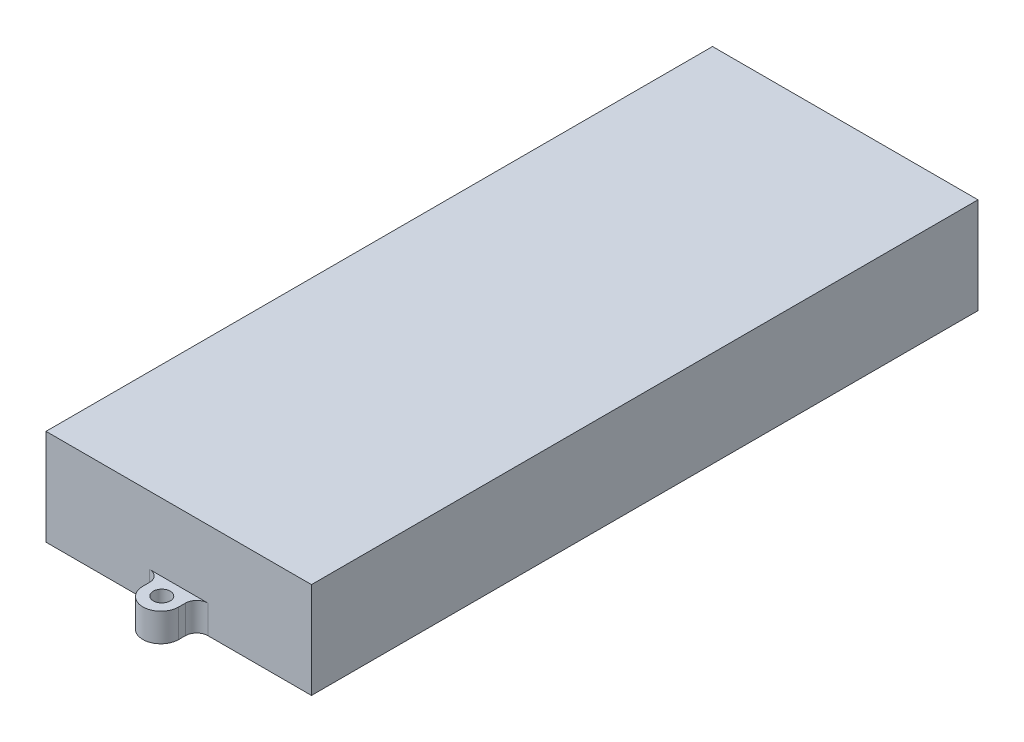
ISO-10303-21;
HEADER;
FILE_DESCRIPTION(('STEP AP214'),'2;1');
FILE_NAME('part.step','',(''),(''),'','','');
FILE_SCHEMA(('AUTOMOTIVE_DESIGN { 1 0 10303 214 1 1 1 1 }'));
ENDSEC;
DATA;
#1=APPLICATION_CONTEXT('core data for automotive mechanical design processes');
#2=APPLICATION_PROTOCOL_DEFINITION('international standard','automotive_design',2000,#1);
#3=PRODUCT_CONTEXT('',#1,'mechanical');
#4=PRODUCT('Part','Part','',(#3));
#5=PRODUCT_RELATED_PRODUCT_CATEGORY('part','',(#4));
#6=PRODUCT_DEFINITION_FORMATION('','',#4);
#7=PRODUCT_DEFINITION_CONTEXT('part definition',#1,'design');
#8=PRODUCT_DEFINITION('design','',#6,#7);
#9=PRODUCT_DEFINITION_SHAPE('','',#8);
#10=(LENGTH_UNIT() NAMED_UNIT(*) SI_UNIT(.MILLI.,.METRE.));
#11=(NAMED_UNIT(*) PLANE_ANGLE_UNIT() SI_UNIT($,.RADIAN.));
#12=(NAMED_UNIT(*) SI_UNIT($,.STERADIAN.) SOLID_ANGLE_UNIT());
#13=UNCERTAINTY_MEASURE_WITH_UNIT(LENGTH_MEASURE(1.E-05),#10,'distance_accuracy_value','');
#14=(GEOMETRIC_REPRESENTATION_CONTEXT(3) GLOBAL_UNCERTAINTY_ASSIGNED_CONTEXT((#13)) GLOBAL_UNIT_ASSIGNED_CONTEXT((#10,
#11,#12)) REPRESENTATION_CONTEXT('',''));
#15=CARTESIAN_POINT('',(0.,0.,0.));
#16=DIRECTION('',(0.,0.,1.));
#17=DIRECTION('',(1.,0.,0.));
#18=AXIS2_PLACEMENT_3D('',#15,#16,#17);
#19=CARTESIAN_POINT('',(-23.5,17.,59.));
#20=DIRECTION('',(0.,0.,-1.));
#21=DIRECTION('',(-1.,0.,0.));
#22=AXIS2_PLACEMENT_3D('',#19,#20,#21);
#23=PLANE('',#22);
#24=DIRECTION('',(1.,0.,0.));
#25=VECTOR('',#24,1.);
#26=CARTESIAN_POINT('',(-23.5,0.,59.));
#27=LINE('',#26,#25);
#28=CARTESIAN_POINT('',(-23.5,0.,59.));
#29=VERTEX_POINT('',#28);
#30=CARTESIAN_POINT('',(-5.175,0.,59.));
#31=VERTEX_POINT('',#30);
#32=EDGE_CURVE('E236',#29,#31,#27,.T.);
#33=ORIENTED_EDGE('',*,*,#32,.T.);
#34=DIRECTION('',(0.,-1.,0.));
#35=VECTOR('',#34,1.);
#36=CARTESIAN_POINT('',(-5.175,5.,59.));
#37=LINE('',#36,#35);
#38=CARTESIAN_POINT('',(-5.175,5.,59.));
#39=VERTEX_POINT('',#38);
#40=EDGE_CURVE('E297',#31,#39,#37,.F.);
#41=ORIENTED_EDGE('',*,*,#40,.T.);
#42=DIRECTION('',(-1.,0.,0.));
#43=VECTOR('',#42,1.);
#44=CARTESIAN_POINT('',(-3.175,5.,59.));
#45=LINE('',#44,#43);
#46=CARTESIAN_POINT('',(5.175,5.,59.));
#47=VERTEX_POINT('',#46);
#48=EDGE_CURVE('E194',#47,#39,#45,.T.);
#49=ORIENTED_EDGE('',*,*,#48,.F.);
#50=DIRECTION('',(0.,-1.,0.));
#51=VECTOR('',#50,1.);
#52=CARTESIAN_POINT('',(5.175,0.,59.));
#53=LINE('',#52,#51);
#54=CARTESIAN_POINT('',(5.175,0.,59.));
#55=VERTEX_POINT('',#54);
#56=EDGE_CURVE('E293',#47,#55,#53,.T.);
#57=ORIENTED_EDGE('',*,*,#56,.T.);
#58=CARTESIAN_POINT('',(23.5,0.,59.));
#59=VERTEX_POINT('',#58);
#60=EDGE_CURVE('E257',#55,#59,#27,.T.);
#61=ORIENTED_EDGE('',*,*,#60,.T.);
#62=DIRECTION('',(0.,-1.,0.));
#63=VECTOR('',#62,1.);
#64=CARTESIAN_POINT('',(23.5,17.,59.));
#65=LINE('',#64,#63);
#66=CARTESIAN_POINT('',(23.5,17.,59.));
#67=VERTEX_POINT('',#66);
#68=EDGE_CURVE('E245',#67,#59,#65,.T.);
#69=ORIENTED_EDGE('',*,*,#68,.F.);
#70=DIRECTION('',(1.,0.,0.));
#71=VECTOR('',#70,1.);
#72=CARTESIAN_POINT('',(-23.5,17.,59.));
#73=LINE('',#72,#71);
#74=CARTESIAN_POINT('',(-23.5,17.,59.));
#75=VERTEX_POINT('',#74);
#76=EDGE_CURVE('E242',#75,#67,#73,.T.);
#77=ORIENTED_EDGE('',*,*,#76,.F.);
#78=DIRECTION('',(0.,-1.,0.));
#79=VECTOR('',#78,1.);
#80=CARTESIAN_POINT('',(-23.5,17.,59.));
#81=LINE('',#80,#79);
#82=EDGE_CURVE('E264',#75,#29,#81,.T.);
#83=ORIENTED_EDGE('',*,*,#82,.T.);
#84=EDGE_LOOP('',(#33,#41,#49,#57,#61,#69,#77,#83));
#85=FACE_BOUND('',#84,.T.);
#86=ADVANCED_FACE('F42',(#85),#23,.F.);
#87=CARTESIAN_POINT('',(-23.5,17.,-59.));
#88=DIRECTION('',(0.,0.,1.));
#89=DIRECTION('',(1.,0.,0.));
#90=AXIS2_PLACEMENT_3D('',#87,#88,#89);
#91=PLANE('',#90);
#92=DIRECTION('',(-1.,0.,0.));
#93=VECTOR('',#92,1.);
#94=CARTESIAN_POINT('',(-23.5,0.,-59.));
#95=LINE('',#94,#93);
#96=CARTESIAN_POINT('',(23.5,0.,-59.));
#97=VERTEX_POINT('',#96);
#98=CARTESIAN_POINT('',(5.175,0.,-59.));
#99=VERTEX_POINT('',#98);
#100=EDGE_CURVE('E250',#97,#99,#95,.T.);
#101=ORIENTED_EDGE('',*,*,#100,.T.);
#102=DIRECTION('',(0.,-1.,0.));
#103=VECTOR('',#102,1.);
#104=CARTESIAN_POINT('',(5.175,5.,-59.));
#105=LINE('',#104,#103);
#106=CARTESIAN_POINT('',(5.175,5.,-59.));
#107=VERTEX_POINT('',#106);
#108=EDGE_CURVE('E284',#99,#107,#105,.F.);
#109=ORIENTED_EDGE('',*,*,#108,.T.);
#110=DIRECTION('',(1.,0.,0.));
#111=VECTOR('',#110,1.);
#112=CARTESIAN_POINT('',(-3.175,5.,-59.));
#113=LINE('',#112,#111);
#114=CARTESIAN_POINT('',(-5.175,5.,-59.));
#115=VERTEX_POINT('',#114);
#116=EDGE_CURVE('E211',#115,#107,#113,.T.);
#117=ORIENTED_EDGE('',*,*,#116,.F.);
#118=DIRECTION('',(0.,-1.,0.));
#119=VECTOR('',#118,1.);
#120=CARTESIAN_POINT('',(-5.175,0.,-59.));
#121=LINE('',#120,#119);
#122=CARTESIAN_POINT('',(-5.175,0.,-59.));
#123=VERTEX_POINT('',#122);
#124=EDGE_CURVE('E280',#115,#123,#121,.T.);
#125=ORIENTED_EDGE('',*,*,#124,.T.);
#126=CARTESIAN_POINT('',(-23.5,0.,-59.));
#127=VERTEX_POINT('',#126);
#128=EDGE_CURVE('E249',#123,#127,#95,.T.);
#129=ORIENTED_EDGE('',*,*,#128,.T.);
#130=DIRECTION('',(0.,-1.,0.));
#131=VECTOR('',#130,1.);
#132=CARTESIAN_POINT('',(-23.5,17.,-59.));
#133=LINE('',#132,#131);
#134=CARTESIAN_POINT('',(-23.5,17.,-59.));
#135=VERTEX_POINT('',#134);
#136=EDGE_CURVE('E268',#135,#127,#133,.T.);
#137=ORIENTED_EDGE('',*,*,#136,.F.);
#138=DIRECTION('',(-1.,0.,0.));
#139=VECTOR('',#138,1.);
#140=CARTESIAN_POINT('',(-23.5,17.,-59.));
#141=LINE('',#140,#139);
#142=CARTESIAN_POINT('',(23.5,17.,-59.));
#143=VERTEX_POINT('',#142);
#144=EDGE_CURVE('E235',#143,#135,#141,.T.);
#145=ORIENTED_EDGE('',*,*,#144,.F.);
#146=DIRECTION('',(0.,-1.,0.));
#147=VECTOR('',#146,1.);
#148=CARTESIAN_POINT('',(23.5,17.,-59.));
#149=LINE('',#148,#147);
#150=EDGE_CURVE('E272',#143,#97,#149,.T.);
#151=ORIENTED_EDGE('',*,*,#150,.T.);
#152=EDGE_LOOP('',(#101,#109,#117,#125,#129,#137,#145,#151));
#153=FACE_BOUND('',#152,.T.);
#154=ADVANCED_FACE('F327',(#153),#91,.F.);
#155=CARTESIAN_POINT('',(23.5,17.,59.));
#156=DIRECTION('',(-1.,0.,0.));
#157=DIRECTION('',(0.,0.,1.));
#158=AXIS2_PLACEMENT_3D('',#155,#156,#157);
#159=PLANE('',#158);
#160=DIRECTION('',(0.,0.,-1.));
#161=VECTOR('',#160,1.);
#162=CARTESIAN_POINT('',(23.5,0.,59.));
#163=LINE('',#162,#161);
#164=EDGE_CURVE('E230',#59,#97,#163,.T.);
#165=ORIENTED_EDGE('',*,*,#164,.T.);
#166=ORIENTED_EDGE('',*,*,#150,.F.);
#167=DIRECTION('',(0.,0.,-1.));
#168=VECTOR('',#167,1.);
#169=CARTESIAN_POINT('',(23.5,17.,59.));
#170=LINE('',#169,#168);
#171=EDGE_CURVE('E231',#67,#143,#170,.T.);
#172=ORIENTED_EDGE('',*,*,#171,.F.);
#173=ORIENTED_EDGE('',*,*,#68,.T.);
#174=EDGE_LOOP('',(#165,#166,#172,#173));
#175=FACE_BOUND('',#174,.T.);
#176=ADVANCED_FACE('F349',(#175),#159,.F.);
#177=CARTESIAN_POINT('',(-23.5,17.,59.));
#178=DIRECTION('',(1.,0.,0.));
#179=DIRECTION('',(0.,0.,-1.));
#180=AXIS2_PLACEMENT_3D('',#177,#178,#179);
#181=PLANE('',#180);
#182=DIRECTION('',(0.,0.,1.));
#183=VECTOR('',#182,1.);
#184=CARTESIAN_POINT('',(-23.5,0.,59.));
#185=LINE('',#184,#183);
#186=EDGE_CURVE('E254',#127,#29,#185,.T.);
#187=ORIENTED_EDGE('',*,*,#186,.T.);
#188=ORIENTED_EDGE('',*,*,#82,.F.);
#189=DIRECTION('',(0.,0.,1.));
#190=VECTOR('',#189,1.);
#191=CARTESIAN_POINT('',(-23.5,17.,59.));
#192=LINE('',#191,#190);
#193=EDGE_CURVE('E239',#135,#75,#192,.T.);
#194=ORIENTED_EDGE('',*,*,#193,.F.);
#195=ORIENTED_EDGE('',*,*,#136,.T.);
#196=EDGE_LOOP('',(#187,#188,#194,#195));
#197=FACE_BOUND('',#196,.T.);
#198=ADVANCED_FACE('F332',(#197),#181,.F.);
#199=CARTESIAN_POINT('',(0.,17.,0.));
#200=DIRECTION('',(0.,-1.,0.));
#201=DIRECTION('',(0.,0.,-1.));
#202=AXIS2_PLACEMENT_3D('',#199,#200,#201);
#203=PLANE('',#202);
#204=ORIENTED_EDGE('',*,*,#171,.T.);
#205=ORIENTED_EDGE('',*,*,#144,.T.);
#206=ORIENTED_EDGE('',*,*,#193,.T.);
#207=ORIENTED_EDGE('',*,*,#76,.T.);
#208=EDGE_LOOP('',(#204,#205,#206,#207));
#209=FACE_BOUND('',#208,.T.);
#210=ADVANCED_FACE('F352',(#209),#203,.F.);
#211=CARTESIAN_POINT('',(0.,0.,0.));
#212=DIRECTION('',(0.,-1.,0.));
#213=DIRECTION('',(0.,0.,-1.));
#214=AXIS2_PLACEMENT_3D('',#211,#212,#213);
#215=PLANE('',#214);
#216=CARTESIAN_POINT('',(0.,0.,62.));
#217=DIRECTION('',(0.,1.,0.));
#218=DIRECTION('',(0.,0.,1.));
#219=AXIS2_PLACEMENT_3D('',#216,#217,#218);
#220=CIRCLE('',#219,1.5);
#221=CARTESIAN_POINT('',(0.,0.,63.5));
#222=VERTEX_POINT('',#221);
#223=EDGE_CURVE('E591',#222,#222,#220,.T.);
#224=ORIENTED_EDGE('',*,*,#223,.T.);
#225=EDGE_LOOP('',(#224));
#226=FACE_BOUND('',#225,.T.);
#227=CARTESIAN_POINT('',(0.,0.,-62.));
#228=DIRECTION('',(0.,1.,0.));
#229=DIRECTION('',(0.,0.,1.));
#230=AXIS2_PLACEMENT_3D('',#227,#228,#229);
#231=CIRCLE('',#230,1.5);
#232=CARTESIAN_POINT('',(0.,0.,-60.5));
#233=VERTEX_POINT('',#232);
#234=EDGE_CURVE('E602',#233,#233,#231,.T.);
#235=ORIENTED_EDGE('',*,*,#234,.T.);
#236=EDGE_LOOP('',(#235));
#237=FACE_BOUND('',#236,.T.);
#238=ORIENTED_EDGE('',*,*,#164,.F.);
#239=ORIENTED_EDGE('',*,*,#60,.F.);
#240=CARTESIAN_POINT('',(5.175,0.,61.));
#241=DIRECTION('',(0.,-1.,0.));
#242=DIRECTION('',(0.,0.,-1.));
#243=AXIS2_PLACEMENT_3D('',#240,#241,#242);
#244=CIRCLE('',#243,2.);
#245=CARTESIAN_POINT('',(3.175,0.,61.));
#246=VERTEX_POINT('',#245);
#247=EDGE_CURVE('E51',#55,#246,#244,.F.);
#248=ORIENTED_EDGE('',*,*,#247,.T.);
#249=DIRECTION('',(0.,0.,-1.));
#250=VECTOR('',#249,1.);
#251=CARTESIAN_POINT('',(3.175,0.,62.175));
#252=LINE('',#251,#250);
#253=CARTESIAN_POINT('',(3.175,0.,62.175));
#254=VERTEX_POINT('',#253);
#255=EDGE_CURVE('E166',#254,#246,#252,.T.);
#256=ORIENTED_EDGE('',*,*,#255,.F.);
#257=CARTESIAN_POINT('',(0.,0.,62.175));
#258=DIRECTION('',(0.,1.,0.));
#259=DIRECTION('',(0.,0.,-1.));
#260=AXIS2_PLACEMENT_3D('',#257,#258,#259);
#261=CIRCLE('',#260,3.175);
#262=CARTESIAN_POINT('',(-3.175,0.,62.175));
#263=VERTEX_POINT('',#262);
#264=EDGE_CURVE('E173',#263,#254,#261,.T.);
#265=ORIENTED_EDGE('',*,*,#264,.F.);
#266=DIRECTION('',(0.,0.,1.));
#267=VECTOR('',#266,1.);
#268=CARTESIAN_POINT('',(-3.175,0.,62.175));
#269=LINE('',#268,#267);
#270=CARTESIAN_POINT('',(-3.175,0.,61.));
#271=VERTEX_POINT('',#270);
#272=EDGE_CURVE('E156',#271,#263,#269,.T.);
#273=ORIENTED_EDGE('',*,*,#272,.F.);
#274=CARTESIAN_POINT('',(-5.175,0.,61.));
#275=DIRECTION('',(0.,-1.,0.));
#276=DIRECTION('',(0.,0.,-1.));
#277=AXIS2_PLACEMENT_3D('',#274,#275,#276);
#278=CIRCLE('',#277,2.);
#279=EDGE_CURVE('E316',#271,#31,#278,.F.);
#280=ORIENTED_EDGE('',*,*,#279,.T.);
#281=ORIENTED_EDGE('',*,*,#32,.F.);
#282=ORIENTED_EDGE('',*,*,#186,.F.);
#283=ORIENTED_EDGE('',*,*,#128,.F.);
#284=CARTESIAN_POINT('',(-5.175,0.,-61.));
#285=DIRECTION('',(0.,-1.,0.));
#286=DIRECTION('',(0.,0.,-1.));
#287=AXIS2_PLACEMENT_3D('',#284,#285,#286);
#288=CIRCLE('',#287,2.);
#289=CARTESIAN_POINT('',(-3.175,0.,-61.));
#290=VERTEX_POINT('',#289);
#291=EDGE_CURVE('E309',#123,#290,#288,.F.);
#292=ORIENTED_EDGE('',*,*,#291,.T.);
#293=DIRECTION('',(0.,0.,1.));
#294=VECTOR('',#293,1.);
#295=CARTESIAN_POINT('',(-3.175,0.,-62.175));
#296=LINE('',#295,#294);
#297=CARTESIAN_POINT('',(-3.175,0.,-62.175));
#298=VERTEX_POINT('',#297);
#299=EDGE_CURVE('E188',#298,#290,#296,.T.);
#300=ORIENTED_EDGE('',*,*,#299,.F.);
#301=CARTESIAN_POINT('',(0.,0.,-62.175));
#302=DIRECTION('',(0.,1.,0.));
#303=DIRECTION('',(0.,0.,1.));
#304=AXIS2_PLACEMENT_3D('',#301,#302,#303);
#305=CIRCLE('',#304,3.175);
#306=CARTESIAN_POINT('',(3.175,0.,-62.175));
#307=VERTEX_POINT('',#306);
#308=EDGE_CURVE('E183',#307,#298,#305,.T.);
#309=ORIENTED_EDGE('',*,*,#308,.F.);
#310=DIRECTION('',(0.,0.,-1.));
#311=VECTOR('',#310,1.);
#312=CARTESIAN_POINT('',(3.175,0.,-62.175));
#313=LINE('',#312,#311);
#314=CARTESIAN_POINT('',(3.175,0.,-61.));
#315=VERTEX_POINT('',#314);
#316=EDGE_CURVE('E207',#315,#307,#313,.T.);
#317=ORIENTED_EDGE('',*,*,#316,.F.);
#318=CARTESIAN_POINT('',(5.175,0.,-61.));
#319=DIRECTION('',(0.,-1.,0.));
#320=DIRECTION('',(0.,0.,-1.));
#321=AXIS2_PLACEMENT_3D('',#318,#319,#320);
#322=CIRCLE('',#321,2.);
#323=EDGE_CURVE('E303',#315,#99,#322,.F.);
#324=ORIENTED_EDGE('',*,*,#323,.T.);
#325=ORIENTED_EDGE('',*,*,#100,.F.);
#326=EDGE_LOOP('',(#238,#239,#248,#256,#265,#273,#280,#281,#282,#283,#292,#300,#309,#317,#324,#325));
#327=FACE_BOUND('',#326,.T.);
#328=ADVANCED_FACE('F180',(#226,#237,#327),#215,.T.);
#329=CARTESIAN_POINT('',(0.,5.,-62.175));
#330=DIRECTION('',(0.,-1.,0.));
#331=DIRECTION('',(0.,0.,-1.));
#332=AXIS2_PLACEMENT_3D('',#329,#330,#331);
#333=CYLINDRICAL_SURFACE('',#332,3.175);
#334=ORIENTED_EDGE('',*,*,#308,.T.);
#335=DIRECTION('',(0.,-1.,0.));
#336=VECTOR('',#335,1.);
#337=CARTESIAN_POINT('',(-3.175,5.,-62.175));
#338=LINE('',#337,#336);
#339=CARTESIAN_POINT('',(-3.175,5.,-62.175));
#340=VERTEX_POINT('',#339);
#341=EDGE_CURVE('E226',#340,#298,#338,.T.);
#342=ORIENTED_EDGE('',*,*,#341,.F.);
#343=CARTESIAN_POINT('',(0.,5.,-62.175));
#344=DIRECTION('',(0.,1.,0.));
#345=DIRECTION('',(0.,0.,1.));
#346=AXIS2_PLACEMENT_3D('',#343,#344,#345);
#347=CIRCLE('',#346,3.175);
#348=CARTESIAN_POINT('',(3.175,5.,-62.175));
#349=VERTEX_POINT('',#348);
#350=EDGE_CURVE('E202',#349,#340,#347,.T.);
#351=ORIENTED_EDGE('',*,*,#350,.F.);
#352=DIRECTION('',(0.,-1.,0.));
#353=VECTOR('',#352,1.);
#354=CARTESIAN_POINT('',(3.175,5.,-62.175));
#355=LINE('',#354,#353);
#356=EDGE_CURVE('E216',#349,#307,#355,.T.);
#357=ORIENTED_EDGE('',*,*,#356,.T.);
#358=EDGE_LOOP('',(#334,#342,#351,#357));
#359=FACE_BOUND('',#358,.T.);
#360=ADVANCED_FACE('F369',(#359),#333,.T.);
#361=CARTESIAN_POINT('',(-3.175,5.,-62.175));
#362=DIRECTION('',(1.,0.,0.));
#363=DIRECTION('',(0.,0.,-1.));
#364=AXIS2_PLACEMENT_3D('',#361,#362,#363);
#365=PLANE('',#364);
#366=ORIENTED_EDGE('',*,*,#299,.T.);
#367=DIRECTION('',(0.,-1.,0.));
#368=VECTOR('',#367,1.);
#369=CARTESIAN_POINT('',(-3.175,5.,-61.));
#370=LINE('',#369,#368);
#371=CARTESIAN_POINT('',(-3.175,5.,-61.));
#372=VERTEX_POINT('',#371);
#373=EDGE_CURVE('E288',#290,#372,#370,.F.);
#374=ORIENTED_EDGE('',*,*,#373,.T.);
#375=DIRECTION('',(0.,0.,1.));
#376=VECTOR('',#375,1.);
#377=CARTESIAN_POINT('',(-3.175,5.,-62.175));
#378=LINE('',#377,#376);
#379=EDGE_CURVE('E206',#340,#372,#378,.T.);
#380=ORIENTED_EDGE('',*,*,#379,.F.);
#381=ORIENTED_EDGE('',*,*,#341,.T.);
#382=EDGE_LOOP('',(#366,#374,#380,#381));
#383=FACE_BOUND('',#382,.T.);
#384=ADVANCED_FACE('F375',(#383),#365,.F.);
#385=CARTESIAN_POINT('',(3.175,5.,-62.175));
#386=DIRECTION('',(-1.,0.,0.));
#387=DIRECTION('',(0.,0.,1.));
#388=AXIS2_PLACEMENT_3D('',#385,#386,#387);
#389=PLANE('',#388);
#390=DIRECTION('',(0.,0.,-1.));
#391=VECTOR('',#390,1.);
#392=CARTESIAN_POINT('',(3.175,5.,-62.175));
#393=LINE('',#392,#391);
#394=CARTESIAN_POINT('',(3.175,5.,-61.));
#395=VERTEX_POINT('',#394);
#396=EDGE_CURVE('E214',#395,#349,#393,.T.);
#397=ORIENTED_EDGE('',*,*,#396,.F.);
#398=DIRECTION('',(0.,-1.,0.));
#399=VECTOR('',#398,1.);
#400=CARTESIAN_POINT('',(3.175,0.,-61.));
#401=LINE('',#400,#399);
#402=EDGE_CURVE('E276',#395,#315,#401,.T.);
#403=ORIENTED_EDGE('',*,*,#402,.T.);
#404=ORIENTED_EDGE('',*,*,#316,.T.);
#405=ORIENTED_EDGE('',*,*,#356,.F.);
#406=EDGE_LOOP('',(#397,#403,#404,#405));
#407=FACE_BOUND('',#406,.T.);
#408=ADVANCED_FACE('F363',(#407),#389,.F.);
#409=CARTESIAN_POINT('',(0.,5.,-62.175));
#410=DIRECTION('',(0.,1.,0.));
#411=DIRECTION('',(0.,0.,1.));
#412=AXIS2_PLACEMENT_3D('',#409,#410,#411);
#413=PLANE('',#412);
#414=CARTESIAN_POINT('',(0.,5.,-62.));
#415=DIRECTION('',(0.,1.,0.));
#416=DIRECTION('',(0.,0.,1.));
#417=AXIS2_PLACEMENT_3D('',#414,#415,#416);
#418=CIRCLE('',#417,1.5);
#419=CARTESIAN_POINT('',(0.,5.,-60.5));
#420=VERTEX_POINT('',#419);
#421=EDGE_CURVE('E596',#420,#420,#418,.T.);
#422=ORIENTED_EDGE('',*,*,#421,.F.);
#423=EDGE_LOOP('',(#422));
#424=FACE_BOUND('',#423,.T.);
#425=ORIENTED_EDGE('',*,*,#350,.T.);
#426=ORIENTED_EDGE('',*,*,#379,.T.);
#427=CARTESIAN_POINT('',(-5.175,5.,-61.));
#428=DIRECTION('',(0.,1.,0.));
#429=DIRECTION('',(0.,0.,1.));
#430=AXIS2_PLACEMENT_3D('',#427,#428,#429);
#431=CIRCLE('',#430,2.);
#432=EDGE_CURVE('E312',#372,#115,#431,.F.);
#433=ORIENTED_EDGE('',*,*,#432,.T.);
#434=ORIENTED_EDGE('',*,*,#116,.T.);
#435=CARTESIAN_POINT('',(5.175,5.,-61.));
#436=DIRECTION('',(0.,1.,0.));
#437=DIRECTION('',(0.,0.,1.));
#438=AXIS2_PLACEMENT_3D('',#435,#436,#437);
#439=CIRCLE('',#438,2.);
#440=EDGE_CURVE('E306',#107,#395,#439,.F.);
#441=ORIENTED_EDGE('',*,*,#440,.T.);
#442=ORIENTED_EDGE('',*,*,#396,.T.);
#443=EDGE_LOOP('',(#425,#426,#433,#434,#441,#442));
#444=FACE_BOUND('',#443,.T.);
#445=ADVANCED_FACE('F360',(#424,#444),#413,.T.);
#446=CARTESIAN_POINT('',(0.,5.,62.175));
#447=DIRECTION('',(0.,-1.,0.));
#448=DIRECTION('',(0.,0.,-1.));
#449=AXIS2_PLACEMENT_3D('',#446,#447,#448);
#450=CYLINDRICAL_SURFACE('',#449,3.175);
#451=ORIENTED_EDGE('',*,*,#264,.T.);
#452=DIRECTION('',(0.,-1.,0.));
#453=VECTOR('',#452,1.);
#454=CARTESIAN_POINT('',(3.175,5.,62.175));
#455=LINE('',#454,#453);
#456=CARTESIAN_POINT('',(3.175,5.,62.175));
#457=VERTEX_POINT('',#456);
#458=EDGE_CURVE('E177',#457,#254,#455,.T.);
#459=ORIENTED_EDGE('',*,*,#458,.F.);
#460=CARTESIAN_POINT('',(0.,5.,62.175));
#461=DIRECTION('',(0.,1.,0.));
#462=DIRECTION('',(0.,0.,-1.));
#463=AXIS2_PLACEMENT_3D('',#460,#461,#462);
#464=CIRCLE('',#463,3.175);
#465=CARTESIAN_POINT('',(-3.175,5.,62.175));
#466=VERTEX_POINT('',#465);
#467=EDGE_CURVE('E167',#466,#457,#464,.T.);
#468=ORIENTED_EDGE('',*,*,#467,.F.);
#469=DIRECTION('',(0.,-1.,0.));
#470=VECTOR('',#469,1.);
#471=CARTESIAN_POINT('',(-3.175,5.,62.175));
#472=LINE('',#471,#470);
#473=EDGE_CURVE('E160',#466,#263,#472,.T.);
#474=ORIENTED_EDGE('',*,*,#473,.T.);
#475=EDGE_LOOP('',(#451,#459,#468,#474));
#476=FACE_BOUND('',#475,.T.);
#477=ADVANCED_FACE('F171',(#476),#450,.T.);
#478=CARTESIAN_POINT('',(3.175,5.,62.175));
#479=DIRECTION('',(-1.,0.,0.));
#480=DIRECTION('',(0.,0.,1.));
#481=AXIS2_PLACEMENT_3D('',#478,#479,#480);
#482=PLANE('',#481);
#483=ORIENTED_EDGE('',*,*,#255,.T.);
#484=DIRECTION('',(0.,-1.,0.));
#485=VECTOR('',#484,1.);
#486=CARTESIAN_POINT('',(3.175,5.,61.));
#487=LINE('',#486,#485);
#488=CARTESIAN_POINT('',(3.175,5.,61.));
#489=VERTEX_POINT('',#488);
#490=EDGE_CURVE('E58',#246,#489,#487,.F.);
#491=ORIENTED_EDGE('',*,*,#490,.T.);
#492=DIRECTION('',(0.,0.,-1.));
#493=VECTOR('',#492,1.);
#494=CARTESIAN_POINT('',(3.175,5.,62.175));
#495=LINE('',#494,#493);
#496=EDGE_CURVE('E197',#457,#489,#495,.T.);
#497=ORIENTED_EDGE('',*,*,#496,.F.);
#498=ORIENTED_EDGE('',*,*,#458,.T.);
#499=EDGE_LOOP('',(#483,#491,#497,#498));
#500=FACE_BOUND('',#499,.T.);
#501=ADVANCED_FACE('F451',(#500),#482,.F.);
#502=CARTESIAN_POINT('',(-3.175,5.,62.175));
#503=DIRECTION('',(1.,0.,0.));
#504=DIRECTION('',(0.,0.,-1.));
#505=AXIS2_PLACEMENT_3D('',#502,#503,#504);
#506=PLANE('',#505);
#507=DIRECTION('',(0.,0.,1.));
#508=VECTOR('',#507,1.);
#509=CARTESIAN_POINT('',(-3.175,5.,62.175));
#510=LINE('',#509,#508);
#511=CARTESIAN_POINT('',(-3.175,5.,61.));
#512=VERTEX_POINT('',#511);
#513=EDGE_CURVE('E176',#512,#466,#510,.T.);
#514=ORIENTED_EDGE('',*,*,#513,.F.);
#515=DIRECTION('',(0.,-1.,0.));
#516=VECTOR('',#515,1.);
#517=CARTESIAN_POINT('',(-3.175,0.,61.));
#518=LINE('',#517,#516);
#519=EDGE_CURVE('E163',#512,#271,#518,.T.);
#520=ORIENTED_EDGE('',*,*,#519,.T.);
#521=ORIENTED_EDGE('',*,*,#272,.T.);
#522=ORIENTED_EDGE('',*,*,#473,.F.);
#523=EDGE_LOOP('',(#514,#520,#521,#522));
#524=FACE_BOUND('',#523,.T.);
#525=ADVANCED_FACE('F159',(#524),#506,.F.);
#526=CARTESIAN_POINT('',(0.,5.,62.175));
#527=DIRECTION('',(0.,-1.,0.));
#528=DIRECTION('',(0.,0.,-1.));
#529=AXIS2_PLACEMENT_3D('',#526,#527,#528);
#530=PLANE('',#529);
#531=CARTESIAN_POINT('',(0.,5.,62.));
#532=DIRECTION('',(0.,1.,0.));
#533=DIRECTION('',(0.,0.,1.));
#534=AXIS2_PLACEMENT_3D('',#531,#532,#533);
#535=CIRCLE('',#534,1.5);
#536=CARTESIAN_POINT('',(0.,5.,63.5));
#537=VERTEX_POINT('',#536);
#538=EDGE_CURVE('E594',#537,#537,#535,.T.);
#539=ORIENTED_EDGE('',*,*,#538,.F.);
#540=EDGE_LOOP('',(#539));
#541=FACE_BOUND('',#540,.T.);
#542=ORIENTED_EDGE('',*,*,#467,.T.);
#543=ORIENTED_EDGE('',*,*,#496,.T.);
#544=CARTESIAN_POINT('',(5.175,5.,61.));
#545=DIRECTION('',(0.,-1.,0.));
#546=DIRECTION('',(0.,0.,-1.));
#547=AXIS2_PLACEMENT_3D('',#544,#545,#546);
#548=CIRCLE('',#547,2.);
#549=EDGE_CURVE('E11',#489,#47,#548,.T.);
#550=ORIENTED_EDGE('',*,*,#549,.T.);
#551=ORIENTED_EDGE('',*,*,#48,.T.);
#552=CARTESIAN_POINT('',(-5.175,5.,61.));
#553=DIRECTION('',(0.,-1.,0.));
#554=DIRECTION('',(0.,0.,-1.));
#555=AXIS2_PLACEMENT_3D('',#552,#553,#554);
#556=CIRCLE('',#555,2.);
#557=EDGE_CURVE('E319',#39,#512,#556,.T.);
#558=ORIENTED_EDGE('',*,*,#557,.T.);
#559=ORIENTED_EDGE('',*,*,#513,.T.);
#560=EDGE_LOOP('',(#542,#543,#550,#551,#558,#559));
#561=FACE_BOUND('',#560,.T.);
#562=ADVANCED_FACE('F342',(#541,#561),#530,.F.);
#563=CARTESIAN_POINT('',(0.,0.,62.));
#564=DIRECTION('',(0.,1.,0.));
#565=DIRECTION('',(0.,0.,1.));
#566=AXIS2_PLACEMENT_3D('',#563,#564,#565);
#567=CYLINDRICAL_SURFACE('',#566,1.5);
#568=ORIENTED_EDGE('',*,*,#223,.F.);
#569=EDGE_LOOP('',(#568));
#570=FACE_BOUND('',#569,.T.);
#571=ORIENTED_EDGE('',*,*,#538,.T.);
#572=EDGE_LOOP('',(#571));
#573=FACE_BOUND('',#572,.T.);
#574=ADVANCED_FACE('F438',(#570,#573),#567,.F.);
#575=CARTESIAN_POINT('',(0.,0.,-62.));
#576=DIRECTION('',(0.,1.,0.));
#577=DIRECTION('',(0.,0.,1.));
#578=AXIS2_PLACEMENT_3D('',#575,#576,#577);
#579=CYLINDRICAL_SURFACE('',#578,1.5);
#580=ORIENTED_EDGE('',*,*,#234,.F.);
#581=EDGE_LOOP('',(#580));
#582=FACE_BOUND('',#581,.T.);
#583=ORIENTED_EDGE('',*,*,#421,.T.);
#584=EDGE_LOOP('',(#583));
#585=FACE_BOUND('',#584,.T.);
#586=ADVANCED_FACE('F399',(#582,#585),#579,.F.);
#587=CARTESIAN_POINT('',(5.175,5.,-61.));
#588=DIRECTION('',(0.,1.,0.));
#589=DIRECTION('',(0.,0.,1.));
#590=AXIS2_PLACEMENT_3D('',#587,#588,#589);
#591=CYLINDRICAL_SURFACE('',#590,2.);
#592=ORIENTED_EDGE('',*,*,#440,.F.);
#593=ORIENTED_EDGE('',*,*,#108,.F.);
#594=ORIENTED_EDGE('',*,*,#323,.F.);
#595=ORIENTED_EDGE('',*,*,#402,.F.);
#596=EDGE_LOOP('',(#592,#593,#594,#595));
#597=FACE_BOUND('',#596,.T.);
#598=ADVANCED_FACE('F356',(#597),#591,.F.);
#599=CARTESIAN_POINT('',(-5.175,17.,-61.));
#600=DIRECTION('',(0.,1.,0.));
#601=DIRECTION('',(0.,0.,1.));
#602=AXIS2_PLACEMENT_3D('',#599,#600,#601);
#603=CYLINDRICAL_SURFACE('',#602,2.);
#604=ORIENTED_EDGE('',*,*,#432,.F.);
#605=ORIENTED_EDGE('',*,*,#373,.F.);
#606=ORIENTED_EDGE('',*,*,#291,.F.);
#607=ORIENTED_EDGE('',*,*,#124,.F.);
#608=EDGE_LOOP('',(#604,#605,#606,#607));
#609=FACE_BOUND('',#608,.T.);
#610=ADVANCED_FACE('F374',(#609),#603,.F.);
#611=CARTESIAN_POINT('',(-5.175,5.,61.));
#612=DIRECTION('',(0.,1.,0.));
#613=DIRECTION('',(0.,0.,1.));
#614=AXIS2_PLACEMENT_3D('',#611,#612,#613);
#615=CYLINDRICAL_SURFACE('',#614,2.);
#616=ORIENTED_EDGE('',*,*,#557,.F.);
#617=ORIENTED_EDGE('',*,*,#40,.F.);
#618=ORIENTED_EDGE('',*,*,#279,.F.);
#619=ORIENTED_EDGE('',*,*,#519,.F.);
#620=EDGE_LOOP('',(#616,#617,#618,#619));
#621=FACE_BOUND('',#620,.T.);
#622=ADVANCED_FACE('F340',(#621),#615,.F.);
#623=CARTESIAN_POINT('',(5.175,17.,61.));
#624=DIRECTION('',(0.,1.,0.));
#625=DIRECTION('',(0.,0.,1.));
#626=AXIS2_PLACEMENT_3D('',#623,#624,#625);
#627=CYLINDRICAL_SURFACE('',#626,2.);
#628=ORIENTED_EDGE('',*,*,#549,.F.);
#629=ORIENTED_EDGE('',*,*,#490,.F.);
#630=ORIENTED_EDGE('',*,*,#247,.F.);
#631=ORIENTED_EDGE('',*,*,#56,.F.);
#632=EDGE_LOOP('',(#628,#629,#630,#631));
#633=FACE_BOUND('',#632,.T.);
#634=ADVANCED_FACE('F44',(#633),#627,.F.);
#635=CLOSED_SHELL('',(#86,#154,#176,#198,#210,#328,#360,#384,#408,#445,#477,#501,#525,#562,#574,
#586,#598,#610,#622,#634));
#636=MANIFOLD_SOLID_BREP('B2',#635);
#637=ADVANCED_BREP_SHAPE_REPRESENTATION('',(#18,#636),#14);
#638=SHAPE_DEFINITION_REPRESENTATION(#9,#637);
ENDSEC;
END-ISO-10303-21;
